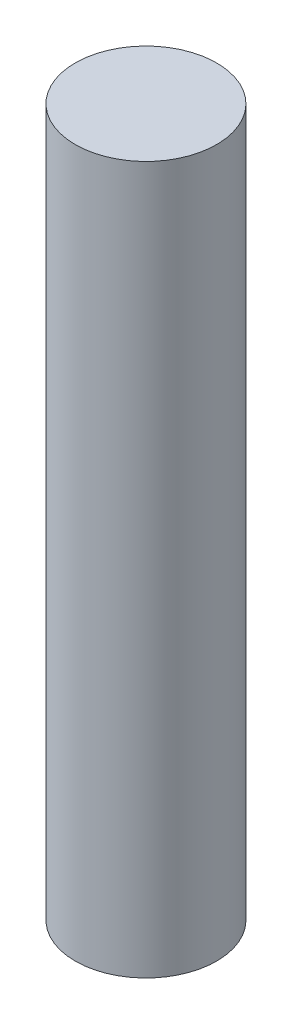
ISO-10303-21;
HEADER;
FILE_DESCRIPTION(('STEP AP214'),'2;1');
FILE_NAME('part.step','',(''),(''),'','','');
FILE_SCHEMA(('AUTOMOTIVE_DESIGN { 1 0 10303 214 1 1 1 1 }'));
ENDSEC;
DATA;
#1=APPLICATION_CONTEXT('core data for automotive mechanical design processes');
#2=APPLICATION_PROTOCOL_DEFINITION('international standard','automotive_design',2000,#1);
#3=PRODUCT_CONTEXT('',#1,'mechanical');
#4=PRODUCT('Part','Part','',(#3));
#5=PRODUCT_RELATED_PRODUCT_CATEGORY('part','',(#4));
#6=PRODUCT_DEFINITION_FORMATION('','',#4);
#7=PRODUCT_DEFINITION_CONTEXT('part definition',#1,'design');
#8=PRODUCT_DEFINITION('design','',#6,#7);
#9=PRODUCT_DEFINITION_SHAPE('','',#8);
#10=(LENGTH_UNIT() NAMED_UNIT(*) SI_UNIT(.MILLI.,.METRE.));
#11=(NAMED_UNIT(*) PLANE_ANGLE_UNIT() SI_UNIT($,.RADIAN.));
#12=(NAMED_UNIT(*) SI_UNIT($,.STERADIAN.) SOLID_ANGLE_UNIT());
#13=UNCERTAINTY_MEASURE_WITH_UNIT(LENGTH_MEASURE(1.E-05),#10,'distance_accuracy_value','');
#14=(GEOMETRIC_REPRESENTATION_CONTEXT(3) GLOBAL_UNCERTAINTY_ASSIGNED_CONTEXT((#13)) GLOBAL_UNIT_ASSIGNED_CONTEXT((#10,
#11,#12)) REPRESENTATION_CONTEXT('',''));
#15=CARTESIAN_POINT('',(0.,0.,0.));
#16=DIRECTION('',(0.,0.,1.));
#17=DIRECTION('',(1.,0.,0.));
#18=AXIS2_PLACEMENT_3D('',#15,#16,#17);
#19=CARTESIAN_POINT('',(0.,200.,0.));
#20=DIRECTION('',(0.,-1.,0.));
#21=DIRECTION('',(0.,0.,-1.));
#22=AXIS2_PLACEMENT_3D('',#19,#20,#21);
#23=CYLINDRICAL_SURFACE('',#22,20.);
#24=CARTESIAN_POINT('',(0.,200.,0.));
#25=DIRECTION('',(0.,1.,0.));
#26=DIRECTION('',(0.,0.,1.));
#27=AXIS2_PLACEMENT_3D('',#24,#25,#26);
#28=CIRCLE('',#27,20.);
#29=CARTESIAN_POINT('',(0.,200.,20.));
#30=VERTEX_POINT('',#29);
#31=EDGE_CURVE('E10',#30,#30,#28,.T.);
#32=ORIENTED_EDGE('',*,*,#31,.F.);
#33=EDGE_LOOP('',(#32));
#34=FACE_BOUND('',#33,.T.);
#35=CARTESIAN_POINT('',(0.,0.,0.));
#36=DIRECTION('',(0.,1.,0.));
#37=DIRECTION('',(0.,0.,1.));
#38=AXIS2_PLACEMENT_3D('',#35,#36,#37);
#39=CIRCLE('',#38,20.);
#40=CARTESIAN_POINT('',(0.,0.,20.));
#41=VERTEX_POINT('',#40);
#42=EDGE_CURVE('E44',#41,#41,#39,.T.);
#43=ORIENTED_EDGE('',*,*,#42,.T.);
#44=EDGE_LOOP('',(#43));
#45=FACE_BOUND('',#44,.T.);
#46=ADVANCED_FACE('F41',(#34,#45),#23,.T.);
#47=CARTESIAN_POINT('',(0.,200.,0.));
#48=DIRECTION('',(0.,1.,0.));
#49=DIRECTION('',(0.,0.,1.));
#50=AXIS2_PLACEMENT_3D('',#47,#48,#49);
#51=PLANE('',#50);
#52=ORIENTED_EDGE('',*,*,#31,.T.);
#53=EDGE_LOOP('',(#52));
#54=FACE_BOUND('',#53,.T.);
#55=ADVANCED_FACE('F56',(#54),#51,.T.);
#56=CARTESIAN_POINT('',(0.,0.,0.));
#57=DIRECTION('',(0.,1.,0.));
#58=DIRECTION('',(0.,0.,1.));
#59=AXIS2_PLACEMENT_3D('',#56,#57,#58);
#60=PLANE('',#59);
#61=ORIENTED_EDGE('',*,*,#42,.F.);
#62=EDGE_LOOP('',(#61));
#63=FACE_BOUND('',#62,.T.);
#64=ADVANCED_FACE('F54',(#63),#60,.F.);
#65=CLOSED_SHELL('',(#46,#55,#64));
#66=MANIFOLD_SOLID_BREP('B2',#65);
#67=ADVANCED_BREP_SHAPE_REPRESENTATION('',(#18,#66),#14);
#68=SHAPE_DEFINITION_REPRESENTATION(#9,#67);
ENDSEC;
END-ISO-10303-21;
